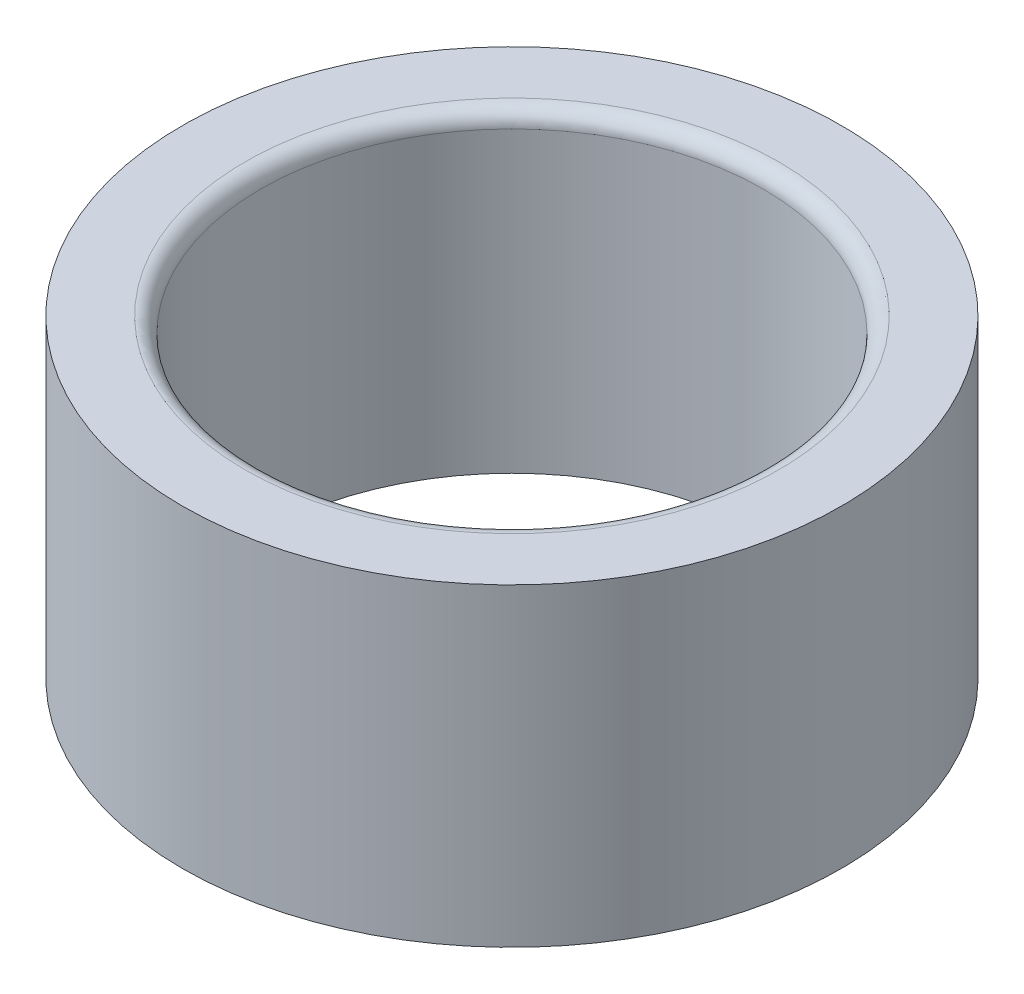
ISO-10303-21;
HEADER;
FILE_DESCRIPTION(('STEP AP214'),'2;1');
FILE_NAME('part.step','',(''),(''),'','','');
FILE_SCHEMA(('AUTOMOTIVE_DESIGN { 1 0 10303 214 1 1 1 1 }'));
ENDSEC;
DATA;
#1=APPLICATION_CONTEXT('core data for automotive mechanical design processes');
#2=APPLICATION_PROTOCOL_DEFINITION('international standard','automotive_design',2000,#1);
#3=PRODUCT_CONTEXT('',#1,'mechanical');
#4=PRODUCT('Part','Part','',(#3));
#5=PRODUCT_RELATED_PRODUCT_CATEGORY('part','',(#4));
#6=PRODUCT_DEFINITION_FORMATION('','',#4);
#7=PRODUCT_DEFINITION_CONTEXT('part definition',#1,'design');
#8=PRODUCT_DEFINITION('design','',#6,#7);
#9=PRODUCT_DEFINITION_SHAPE('','',#8);
#10=(LENGTH_UNIT() NAMED_UNIT(*) SI_UNIT(.MILLI.,.METRE.));
#11=(NAMED_UNIT(*) PLANE_ANGLE_UNIT() SI_UNIT($,.RADIAN.));
#12=(NAMED_UNIT(*) SI_UNIT($,.STERADIAN.) SOLID_ANGLE_UNIT());
#13=UNCERTAINTY_MEASURE_WITH_UNIT(LENGTH_MEASURE(1.E-05),#10,'distance_accuracy_value','');
#14=(GEOMETRIC_REPRESENTATION_CONTEXT(3) GLOBAL_UNCERTAINTY_ASSIGNED_CONTEXT((#13)) GLOBAL_UNIT_ASSIGNED_CONTEXT((#10,
#11,#12)) REPRESENTATION_CONTEXT('',''));
#15=CARTESIAN_POINT('',(0.,0.,0.));
#16=DIRECTION('',(0.,0.,1.));
#17=DIRECTION('',(1.,0.,0.));
#18=AXIS2_PLACEMENT_3D('',#15,#16,#17);
#19=CARTESIAN_POINT('',(0.,20.,0.));
#20=DIRECTION('',(0.,1.,0.));
#21=DIRECTION('',(0.,0.,1.));
#22=AXIS2_PLACEMENT_3D('',#19,#20,#21);
#23=PLANE('',#22);
#24=CARTESIAN_POINT('',(0.,20.,0.));
#25=DIRECTION('',(0.,1.,0.));
#26=DIRECTION('',(0.,0.,1.));
#27=AXIS2_PLACEMENT_3D('',#24,#25,#26);
#28=CIRCLE('',#27,17.);
#29=CARTESIAN_POINT('',(0.,20.,17.));
#30=VERTEX_POINT('',#29);
#31=EDGE_CURVE('E10',#30,#30,#28,.F.);
#32=ORIENTED_EDGE('',*,*,#31,.T.);
#33=EDGE_LOOP('',(#32));
#34=FACE_BOUND('',#33,.T.);
#35=CARTESIAN_POINT('',(0.,20.,0.));
#36=DIRECTION('',(0.,1.,0.));
#37=DIRECTION('',(0.,0.,1.));
#38=AXIS2_PLACEMENT_3D('',#35,#36,#37);
#39=CIRCLE('',#38,21.);
#40=CARTESIAN_POINT('',(0.,20.,21.));
#41=VERTEX_POINT('',#40);
#42=EDGE_CURVE('E42',#41,#41,#39,.T.);
#43=ORIENTED_EDGE('',*,*,#42,.T.);
#44=EDGE_LOOP('',(#43));
#45=FACE_BOUND('',#44,.T.);
#46=ADVANCED_FACE('F31',(#34,#45),#23,.T.);
#47=CARTESIAN_POINT('',(0.,0.,0.));
#48=DIRECTION('',(0.,1.,0.));
#49=DIRECTION('',(0.,0.,1.));
#50=AXIS2_PLACEMENT_3D('',#47,#48,#49);
#51=PLANE('',#50);
#52=CARTESIAN_POINT('',(0.,0.,0.));
#53=DIRECTION('',(0.,1.,0.));
#54=DIRECTION('',(0.,0.,1.));
#55=AXIS2_PLACEMENT_3D('',#52,#53,#54);
#56=CIRCLE('',#55,21.);
#57=CARTESIAN_POINT('',(0.,0.,21.));
#58=VERTEX_POINT('',#57);
#59=EDGE_CURVE('E46',#58,#58,#56,.T.);
#60=ORIENTED_EDGE('',*,*,#59,.F.);
#61=EDGE_LOOP('',(#60));
#62=FACE_BOUND('',#61,.T.);
#63=CARTESIAN_POINT('',(0.,0.,0.));
#64=DIRECTION('',(0.,1.,0.));
#65=DIRECTION('',(0.,0.,1.));
#66=AXIS2_PLACEMENT_3D('',#63,#64,#65);
#67=CIRCLE('',#66,16.);
#68=CARTESIAN_POINT('',(0.,0.,16.));
#69=VERTEX_POINT('',#68);
#70=EDGE_CURVE('E50',#69,#69,#67,.T.);
#71=ORIENTED_EDGE('',*,*,#70,.T.);
#72=EDGE_LOOP('',(#71));
#73=FACE_BOUND('',#72,.T.);
#74=ADVANCED_FACE('F55',(#62,#73),#51,.F.);
#75=CARTESIAN_POINT('',(0.,20.,0.));
#76=DIRECTION('',(0.,-1.,0.));
#77=DIRECTION('',(0.,0.,-1.));
#78=AXIS2_PLACEMENT_3D('',#75,#76,#77);
#79=CYLINDRICAL_SURFACE('',#78,21.);
#80=ORIENTED_EDGE('',*,*,#42,.F.);
#81=EDGE_LOOP('',(#80));
#82=FACE_BOUND('',#81,.T.);
#83=ORIENTED_EDGE('',*,*,#59,.T.);
#84=EDGE_LOOP('',(#83));
#85=FACE_BOUND('',#84,.T.);
#86=ADVANCED_FACE('F59',(#82,#85),#79,.T.);
#87=CARTESIAN_POINT('',(0.,20.,0.));
#88=DIRECTION('',(0.,-1.,0.));
#89=DIRECTION('',(0.,0.,-1.));
#90=AXIS2_PLACEMENT_3D('',#87,#88,#89);
#91=CYLINDRICAL_SURFACE('',#90,16.);
#92=CARTESIAN_POINT('',(0.,19.,0.));
#93=DIRECTION('',(0.,1.,0.));
#94=DIRECTION('',(0.,0.,1.));
#95=AXIS2_PLACEMENT_3D('',#92,#93,#94);
#96=CIRCLE('',#95,16.);
#97=CARTESIAN_POINT('',(0.,19.,16.));
#98=VERTEX_POINT('',#97);
#99=EDGE_CURVE('E38',#98,#98,#96,.T.);
#100=ORIENTED_EDGE('',*,*,#99,.T.);
#101=EDGE_LOOP('',(#100));
#102=FACE_BOUND('',#101,.T.);
#103=ORIENTED_EDGE('',*,*,#70,.F.);
#104=EDGE_LOOP('',(#103));
#105=FACE_BOUND('',#104,.T.);
#106=ADVANCED_FACE('F57',(#102,#105),#91,.F.);
#107=CARTESIAN_POINT('',(0.,19.,0.));
#108=DIRECTION('',(0.,1.,0.));
#109=DIRECTION('',(0.,0.,1.));
#110=AXIS2_PLACEMENT_3D('',#107,#108,#109);
#111=TOROIDAL_SURFACE('',#110,17.,1.);
#112=ORIENTED_EDGE('',*,*,#31,.F.);
#113=EDGE_LOOP('',(#112));
#114=FACE_BOUND('',#113,.T.);
#115=ORIENTED_EDGE('',*,*,#99,.F.);
#116=EDGE_LOOP('',(#115));
#117=FACE_BOUND('',#116,.T.);
#118=ADVANCED_FACE('F33',(#114,#117),#111,.T.);
#119=CLOSED_SHELL('',(#46,#74,#86,#106,#118));
#120=MANIFOLD_SOLID_BREP('B2',#119);
#121=ADVANCED_BREP_SHAPE_REPRESENTATION('',(#18,#120),#14);
#122=SHAPE_DEFINITION_REPRESENTATION(#9,#121);
ENDSEC;
END-ISO-10303-21;
